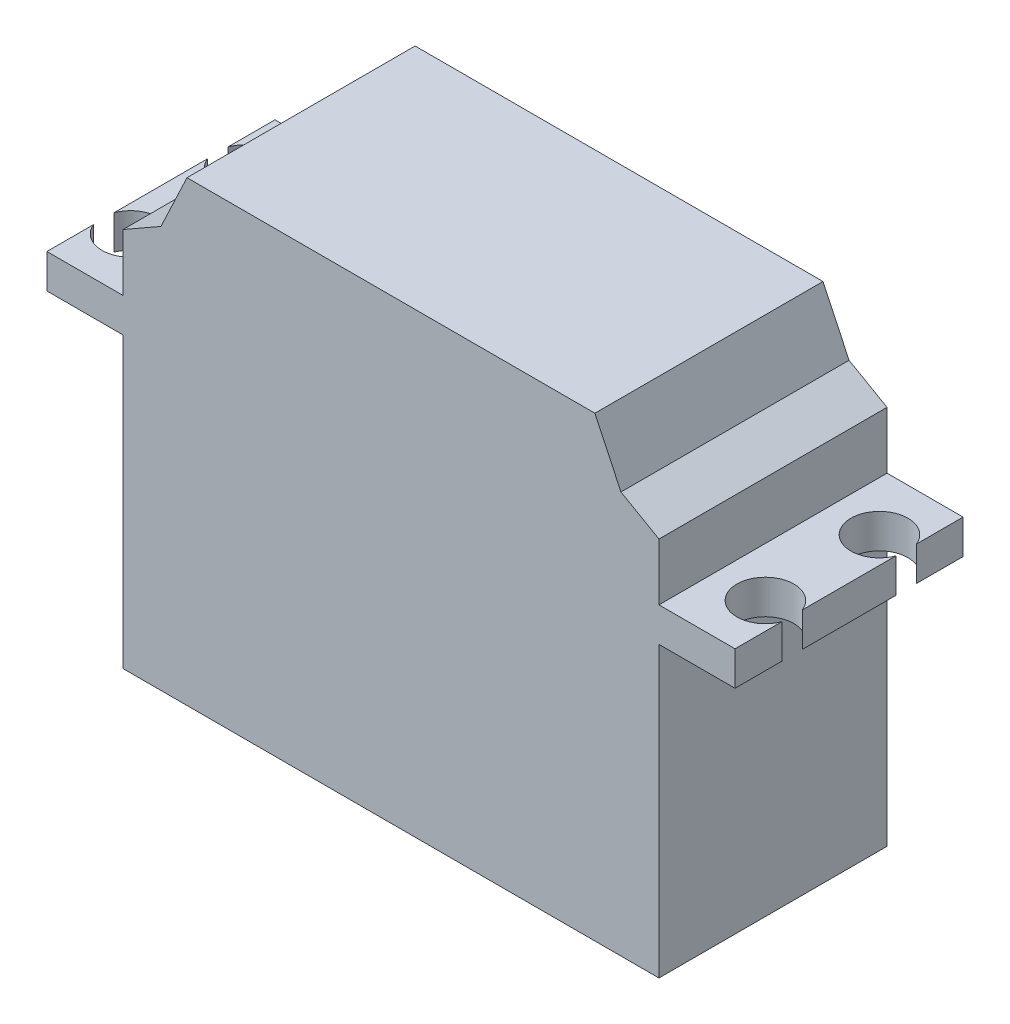
ISO-10303-21;
HEADER;
FILE_DESCRIPTION(('STEP AP214'),'2;1');
FILE_NAME('part.step','',(''),(''),'','','');
FILE_SCHEMA(('AUTOMOTIVE_DESIGN { 1 0 10303 214 1 1 1 1 }'));
ENDSEC;
DATA;
#1=APPLICATION_CONTEXT('core data for automotive mechanical design processes');
#2=APPLICATION_PROTOCOL_DEFINITION('international standard','automotive_design',2000,#1);
#3=PRODUCT_CONTEXT('',#1,'mechanical');
#4=PRODUCT('Part','Part','',(#3));
#5=PRODUCT_RELATED_PRODUCT_CATEGORY('part','',(#4));
#6=PRODUCT_DEFINITION_FORMATION('','',#4);
#7=PRODUCT_DEFINITION_CONTEXT('part definition',#1,'design');
#8=PRODUCT_DEFINITION('design','',#6,#7);
#9=PRODUCT_DEFINITION_SHAPE('','',#8);
#10=(LENGTH_UNIT() NAMED_UNIT(*) SI_UNIT(.MILLI.,.METRE.));
#11=(NAMED_UNIT(*) PLANE_ANGLE_UNIT() SI_UNIT($,.RADIAN.));
#12=(NAMED_UNIT(*) SI_UNIT($,.STERADIAN.) SOLID_ANGLE_UNIT());
#13=UNCERTAINTY_MEASURE_WITH_UNIT(LENGTH_MEASURE(1.E-05),#10,'distance_accuracy_value','');
#14=(GEOMETRIC_REPRESENTATION_CONTEXT(3) GLOBAL_UNCERTAINTY_ASSIGNED_CONTEXT((#13)) GLOBAL_UNIT_ASSIGNED_CONTEXT((#10,
#11,#12)) REPRESENTATION_CONTEXT('',''));
#15=CARTESIAN_POINT('',(0.,0.,0.));
#16=DIRECTION('',(0.,0.,1.));
#17=DIRECTION('',(1.,0.,0.));
#18=AXIS2_PLACEMENT_3D('',#15,#16,#17);
#19=CARTESIAN_POINT('',(-22.987,19.304,13.1906548986632));
#20=DIRECTION('',(-1.,0.,0.));
#21=DIRECTION('',(0.,0.,-1.));
#22=AXIS2_PLACEMENT_3D('',#19,#20,#21);
#23=PLANE('',#22);
#24=DIRECTION('',(0.,1.,0.));
#25=VECTOR('',#24,1.);
#26=CARTESIAN_POINT('',(-22.987,13.9158463273585,-4.49391593050608));
#27=LINE('',#26,#25);
#28=CARTESIAN_POINT('',(-22.987,19.304,-4.49391593050608));
#29=VERTEX_POINT('',#28);
#30=CARTESIAN_POINT('',(-22.987,21.59,-4.49391593050608));
#31=VERTEX_POINT('',#30);
#32=EDGE_CURVE('E11',#29,#31,#27,.T.);
#33=ORIENTED_EDGE('',*,*,#32,.T.);
#34=DIRECTION('',(0.,0.,-1.));
#35=VECTOR('',#34,1.);
#36=CARTESIAN_POINT('',(-22.987,21.59,13.1906548986632));
#37=LINE('',#36,#35);
#38=CARTESIAN_POINT('',(-22.987,21.59,-7.62));
#39=VERTEX_POINT('',#38);
#40=EDGE_CURVE('E267',#31,#39,#37,.T.);
#41=ORIENTED_EDGE('',*,*,#40,.T.);
#42=DIRECTION('',(0.,-1.,0.));
#43=VECTOR('',#42,1.);
#44=CARTESIAN_POINT('',(-22.987,19.304,-7.62));
#45=LINE('',#44,#43);
#46=CARTESIAN_POINT('',(-22.987,19.304,-7.62));
#47=VERTEX_POINT('',#46);
#48=EDGE_CURVE('E400',#39,#47,#45,.T.);
#49=ORIENTED_EDGE('',*,*,#48,.T.);
#50=DIRECTION('',(0.,0.,-1.));
#51=VECTOR('',#50,1.);
#52=CARTESIAN_POINT('',(-22.987,19.304,13.1906548986632));
#53=LINE('',#52,#51);
#54=EDGE_CURVE('E259',#29,#47,#53,.T.);
#55=ORIENTED_EDGE('',*,*,#54,.F.);
#56=EDGE_LOOP('',(#33,#41,#49,#55));
#57=FACE_BOUND('',#56,.T.);
#58=ADVANCED_FACE('F37',(#57),#23,.T.);
#59=DIRECTION('',(0.,1.,0.));
#60=VECTOR('',#59,1.);
#61=CARTESIAN_POINT('',(-22.987,13.9158463273585,-3.12608406949392));
#62=LINE('',#61,#60);
#63=CARTESIAN_POINT('',(-22.987,21.59,-3.12608406949392));
#64=VERTEX_POINT('',#63);
#65=CARTESIAN_POINT('',(-22.987,19.304,-3.12608406949392));
#66=VERTEX_POINT('',#65);
#67=EDGE_CURVE('E45',#64,#66,#62,.F.);
#68=ORIENTED_EDGE('',*,*,#67,.T.);
#69=CARTESIAN_POINT('',(-22.987,19.304,3.12608406949391));
#70=VERTEX_POINT('',#69);
#71=EDGE_CURVE('E245',#70,#66,#53,.T.);
#72=ORIENTED_EDGE('',*,*,#71,.F.);
#73=DIRECTION('',(0.,1.,0.));
#74=VECTOR('',#73,1.);
#75=CARTESIAN_POINT('',(-22.987,13.9158463273585,3.12608406949391));
#76=LINE('',#75,#74);
#77=CARTESIAN_POINT('',(-22.987,21.59,3.12608406949391));
#78=VERTEX_POINT('',#77);
#79=EDGE_CURVE('E237',#70,#78,#76,.T.);
#80=ORIENTED_EDGE('',*,*,#79,.T.);
#81=EDGE_CURVE('E246',#78,#64,#37,.T.);
#82=ORIENTED_EDGE('',*,*,#81,.T.);
#83=EDGE_LOOP('',(#68,#72,#80,#82));
#84=FACE_BOUND('',#83,.T.);
#85=ADVANCED_FACE('F243',(#84),#23,.T.);
#86=CARTESIAN_POINT('',(22.987,19.304,13.1906548986632));
#87=DIRECTION('',(1.,0.,0.));
#88=DIRECTION('',(0.,0.,1.));
#89=AXIS2_PLACEMENT_3D('',#86,#87,#88);
#90=PLANE('',#89);
#91=DIRECTION('',(0.,1.,0.));
#92=VECTOR('',#91,1.);
#93=CARTESIAN_POINT('',(22.987,13.9158463273585,4.4939159305061));
#94=LINE('',#93,#92);
#95=CARTESIAN_POINT('',(22.987,19.304,4.4939159305061));
#96=VERTEX_POINT('',#95);
#97=CARTESIAN_POINT('',(22.987,21.59,4.4939159305061));
#98=VERTEX_POINT('',#97);
#99=EDGE_CURVE('E228',#96,#98,#94,.T.);
#100=ORIENTED_EDGE('',*,*,#99,.T.);
#101=DIRECTION('',(0.,0.,-1.));
#102=VECTOR('',#101,1.);
#103=CARTESIAN_POINT('',(22.987,21.59,13.1906548986632));
#104=LINE('',#103,#102);
#105=CARTESIAN_POINT('',(22.987,21.59,7.62));
#106=VERTEX_POINT('',#105);
#107=EDGE_CURVE('E220',#106,#98,#104,.T.);
#108=ORIENTED_EDGE('',*,*,#107,.F.);
#109=DIRECTION('',(0.,-1.,0.));
#110=VECTOR('',#109,1.);
#111=CARTESIAN_POINT('',(22.987,19.304,7.62));
#112=LINE('',#111,#110);
#113=CARTESIAN_POINT('',(22.987,19.304,7.62));
#114=VERTEX_POINT('',#113);
#115=EDGE_CURVE('E389',#106,#114,#112,.T.);
#116=ORIENTED_EDGE('',*,*,#115,.T.);
#117=DIRECTION('',(0.,0.,-1.));
#118=VECTOR('',#117,1.);
#119=CARTESIAN_POINT('',(22.987,19.304,13.1906548986632));
#120=LINE('',#119,#118);
#121=EDGE_CURVE('E385',#114,#96,#120,.T.);
#122=ORIENTED_EDGE('',*,*,#121,.T.);
#123=EDGE_LOOP('',(#100,#108,#116,#122));
#124=FACE_BOUND('',#123,.T.);
#125=ADVANCED_FACE('F433',(#124),#90,.T.);
#126=DIRECTION('',(0.,1.,0.));
#127=VECTOR('',#126,1.);
#128=CARTESIAN_POINT('',(22.987,13.9158463273585,3.12608406949393));
#129=LINE('',#128,#127);
#130=CARTESIAN_POINT('',(22.987,21.59,3.12608406949393));
#131=VERTEX_POINT('',#130);
#132=CARTESIAN_POINT('',(22.987,19.304,3.12608406949393));
#133=VERTEX_POINT('',#132);
#134=EDGE_CURVE('E226',#131,#133,#129,.F.);
#135=ORIENTED_EDGE('',*,*,#134,.T.);
#136=CARTESIAN_POINT('',(22.987,19.304,-3.12608406949391));
#137=VERTEX_POINT('',#136);
#138=EDGE_CURVE('E225',#133,#137,#120,.T.);
#139=ORIENTED_EDGE('',*,*,#138,.T.);
#140=DIRECTION('',(0.,1.,0.));
#141=VECTOR('',#140,1.);
#142=CARTESIAN_POINT('',(22.987,13.9158463273585,-3.12608406949391));
#143=LINE('',#142,#141);
#144=CARTESIAN_POINT('',(22.987,21.59,-3.12608406949391));
#145=VERTEX_POINT('',#144);
#146=EDGE_CURVE('E204',#137,#145,#143,.T.);
#147=ORIENTED_EDGE('',*,*,#146,.T.);
#148=EDGE_CURVE('E213',#131,#145,#104,.T.);
#149=ORIENTED_EDGE('',*,*,#148,.F.);
#150=EDGE_LOOP('',(#135,#139,#147,#149));
#151=FACE_BOUND('',#150,.T.);
#152=ADVANCED_FACE('F223',(#151),#90,.T.);
#153=CARTESIAN_POINT('',(17.907,25.4,7.62));
#154=DIRECTION('',(-1.,0.,0.));
#155=DIRECTION('',(0.,0.,-1.));
#156=AXIS2_PLACEMENT_3D('',#153,#154,#155);
#157=PLANE('',#156);
#158=DIRECTION('',(0.,0.,-1.));
#159=VECTOR('',#158,1.);
#160=CARTESIAN_POINT('',(17.907,21.59,13.1906548986632));
#161=LINE('',#160,#159);
#162=CARTESIAN_POINT('',(17.907,21.59,7.62));
#163=VERTEX_POINT('',#162);
#164=CARTESIAN_POINT('',(17.907,21.59,-7.62));
#165=VERTEX_POINT('',#164);
#166=EDGE_CURVE('E377',#163,#165,#161,.T.);
#167=ORIENTED_EDGE('',*,*,#166,.T.);
#168=DIRECTION('',(0.,-1.,0.));
#169=VECTOR('',#168,1.);
#170=CARTESIAN_POINT('',(17.907,25.4,-7.62));
#171=LINE('',#170,#169);
#172=CARTESIAN_POINT('',(17.907,25.4,-7.62));
#173=VERTEX_POINT('',#172);
#174=EDGE_CURVE('E325',#173,#165,#171,.T.);
#175=ORIENTED_EDGE('',*,*,#174,.F.);
#176=DIRECTION('',(0.,0.,1.));
#177=VECTOR('',#176,1.);
#178=CARTESIAN_POINT('',(17.907,25.4,7.62));
#179=LINE('',#178,#177);
#180=CARTESIAN_POINT('',(17.907,25.4,7.62));
#181=VERTEX_POINT('',#180);
#182=EDGE_CURVE('E309',#173,#181,#179,.T.);
#183=ORIENTED_EDGE('',*,*,#182,.T.);
#184=DIRECTION('',(0.,-1.,0.));
#185=VECTOR('',#184,1.);
#186=CARTESIAN_POINT('',(17.907,25.4,7.62));
#187=LINE('',#186,#185);
#188=EDGE_CURVE('E230',#181,#163,#187,.T.);
#189=ORIENTED_EDGE('',*,*,#188,.T.);
#190=EDGE_LOOP('',(#167,#175,#183,#189));
#191=FACE_BOUND('',#190,.T.);
#192=ADVANCED_FACE('F460',(#191),#157,.F.);
#193=CARTESIAN_POINT('',(-17.907,25.4,7.62));
#194=DIRECTION('',(1.,0.,0.));
#195=DIRECTION('',(0.,0.,1.));
#196=AXIS2_PLACEMENT_3D('',#193,#194,#195);
#197=PLANE('',#196);
#198=DIRECTION('',(0.,0.,-1.));
#199=VECTOR('',#198,1.);
#200=CARTESIAN_POINT('',(-17.907,19.304,13.1906548986632));
#201=LINE('',#200,#199);
#202=CARTESIAN_POINT('',(-17.907,19.304,7.62));
#203=VERTEX_POINT('',#202);
#204=CARTESIAN_POINT('',(-17.907,19.304,-7.62));
#205=VERTEX_POINT('',#204);
#206=EDGE_CURVE('E261',#203,#205,#201,.T.);
#207=ORIENTED_EDGE('',*,*,#206,.T.);
#208=DIRECTION('',(0.,-1.,0.));
#209=VECTOR('',#208,1.);
#210=CARTESIAN_POINT('',(-17.907,25.4,-7.62));
#211=LINE('',#210,#209);
#212=CARTESIAN_POINT('',(-17.907,0.,-7.62));
#213=VERTEX_POINT('',#212);
#214=EDGE_CURVE('E328',#205,#213,#211,.T.);
#215=ORIENTED_EDGE('',*,*,#214,.T.);
#216=DIRECTION('',(0.,0.,-1.));
#217=VECTOR('',#216,1.);
#218=CARTESIAN_POINT('',(-17.907,0.,7.62));
#219=LINE('',#218,#217);
#220=CARTESIAN_POINT('',(-17.907,0.,7.62));
#221=VERTEX_POINT('',#220);
#222=EDGE_CURVE('E321',#221,#213,#219,.T.);
#223=ORIENTED_EDGE('',*,*,#222,.F.);
#224=DIRECTION('',(0.,-1.,0.));
#225=VECTOR('',#224,1.);
#226=CARTESIAN_POINT('',(-17.907,25.4,7.62));
#227=LINE('',#226,#225);
#228=EDGE_CURVE('E332',#203,#221,#227,.T.);
#229=ORIENTED_EDGE('',*,*,#228,.F.);
#230=EDGE_LOOP('',(#207,#215,#223,#229));
#231=FACE_BOUND('',#230,.T.);
#232=ADVANCED_FACE('F408',(#231),#197,.F.);
#233=CARTESIAN_POINT('',(17.907,19.304,7.62));
#234=VERTEX_POINT('',#233);
#235=CARTESIAN_POINT('',(17.907,0.,7.62));
#236=VERTEX_POINT('',#235);
#237=EDGE_CURVE('E335',#234,#236,#187,.T.);
#238=ORIENTED_EDGE('',*,*,#237,.T.);
#239=DIRECTION('',(0.,0.,1.));
#240=VECTOR('',#239,1.);
#241=CARTESIAN_POINT('',(17.907,0.,7.62));
#242=LINE('',#241,#240);
#243=CARTESIAN_POINT('',(17.907,0.,-7.62));
#244=VERTEX_POINT('',#243);
#245=EDGE_CURVE('E308',#244,#236,#242,.T.);
#246=ORIENTED_EDGE('',*,*,#245,.F.);
#247=CARTESIAN_POINT('',(17.907,19.304,-7.62));
#248=VERTEX_POINT('',#247);
#249=EDGE_CURVE('E316',#248,#244,#171,.T.);
#250=ORIENTED_EDGE('',*,*,#249,.F.);
#251=DIRECTION('',(0.,0.,-1.));
#252=VECTOR('',#251,1.);
#253=CARTESIAN_POINT('',(17.907,19.304,13.1906548986632));
#254=LINE('',#253,#252);
#255=EDGE_CURVE('E348',#234,#248,#254,.T.);
#256=ORIENTED_EDGE('',*,*,#255,.F.);
#257=EDGE_LOOP('',(#238,#246,#250,#256));
#258=FACE_BOUND('',#257,.T.);
#259=ADVANCED_FACE('F39',(#258),#157,.F.);
#260=CARTESIAN_POINT('',(-17.907,25.4,7.62));
#261=DIRECTION('',(0.,0.,-1.));
#262=DIRECTION('',(1.,0.,0.));
#263=AXIS2_PLACEMENT_3D('',#260,#261,#262);
#264=PLANE('',#263);
#265=DIRECTION('',(0.868243142124459,0.496138938356834,0.));
#266=VECTOR('',#265,1.);
#267=CARTESIAN_POINT('',(-17.907,25.4,7.62));
#268=LINE('',#267,#266);
#269=CARTESIAN_POINT('',(-17.907,25.4,7.62));
#270=VERTEX_POINT('',#269);
#271=CARTESIAN_POINT('',(-15.367,26.8514285714286,7.62));
#272=VERTEX_POINT('',#271);
#273=EDGE_CURVE('E299',#270,#272,#268,.T.);
#274=ORIENTED_EDGE('',*,*,#273,.F.);
#275=CARTESIAN_POINT('',(-17.907,21.59,7.62));
#276=VERTEX_POINT('',#275);
#277=EDGE_CURVE('E333',#270,#276,#227,.T.);
#278=ORIENTED_EDGE('',*,*,#277,.T.);
#279=DIRECTION('',(1.,0.,0.));
#280=VECTOR('',#279,1.);
#281=CARTESIAN_POINT('',(-22.987,21.59,7.62));
#282=LINE('',#281,#280);
#283=CARTESIAN_POINT('',(-22.987,21.59,7.62));
#284=VERTEX_POINT('',#283);
#285=EDGE_CURVE('E272',#284,#276,#282,.T.);
#286=ORIENTED_EDGE('',*,*,#285,.F.);
#287=DIRECTION('',(0.,1.,0.));
#288=VECTOR('',#287,1.);
#289=CARTESIAN_POINT('',(-22.987,19.304,7.62));
#290=LINE('',#289,#288);
#291=CARTESIAN_POINT('',(-22.987,19.304,7.62));
#292=VERTEX_POINT('',#291);
#293=EDGE_CURVE('E268',#292,#284,#290,.T.);
#294=ORIENTED_EDGE('',*,*,#293,.F.);
#295=DIRECTION('',(-1.,0.,0.));
#296=VECTOR('',#295,1.);
#297=CARTESIAN_POINT('',(-17.907,19.304,7.62));
#298=LINE('',#297,#296);
#299=EDGE_CURVE('E393',#203,#292,#298,.T.);
#300=ORIENTED_EDGE('',*,*,#299,.F.);
#301=ORIENTED_EDGE('',*,*,#228,.T.);
#302=DIRECTION('',(-1.,0.,0.));
#303=VECTOR('',#302,1.);
#304=CARTESIAN_POINT('',(-17.907,0.,7.62));
#305=LINE('',#304,#303);
#306=EDGE_CURVE('E319',#236,#221,#305,.T.);
#307=ORIENTED_EDGE('',*,*,#306,.F.);
#308=ORIENTED_EDGE('',*,*,#237,.F.);
#309=DIRECTION('',(-1.,0.,0.));
#310=VECTOR('',#309,1.);
#311=CARTESIAN_POINT('',(17.907,19.304,7.62));
#312=LINE('',#311,#310);
#313=EDGE_CURVE('E353',#114,#234,#312,.T.);
#314=ORIENTED_EDGE('',*,*,#313,.F.);
#315=ORIENTED_EDGE('',*,*,#115,.F.);
#316=DIRECTION('',(1.,0.,0.));
#317=VECTOR('',#316,1.);
#318=CARTESIAN_POINT('',(22.987,21.59,7.62));
#319=LINE('',#318,#317);
#320=EDGE_CURVE('E376',#163,#106,#319,.T.);
#321=ORIENTED_EDGE('',*,*,#320,.F.);
#322=ORIENTED_EDGE('',*,*,#188,.F.);
#323=DIRECTION('',(0.868243142124459,-0.496138938356834,0.));
#324=VECTOR('',#323,1.);
#325=CARTESIAN_POINT('',(9.017,30.48,7.62));
#326=LINE('',#325,#324);
#327=CARTESIAN_POINT('',(15.367,26.8514285714286,7.62));
#328=VERTEX_POINT('',#327);
#329=EDGE_CURVE('E302',#328,#181,#326,.T.);
#330=ORIENTED_EDGE('',*,*,#329,.F.);
#331=DIRECTION('',(0.426649540613449,-0.90441703295235,0.));
#332=VECTOR('',#331,1.);
#333=CARTESIAN_POINT('',(15.367,26.8514285714286,7.62));
#334=LINE('',#333,#332);
#335=CARTESIAN_POINT('',(13.6268844552524,30.5401472694776,7.62));
#336=VERTEX_POINT('',#335);
#337=EDGE_CURVE('E273',#336,#328,#334,.T.);
#338=ORIENTED_EDGE('',*,*,#337,.F.);
#339=DIRECTION('',(1.,0.,0.));
#340=VECTOR('',#339,1.);
#341=CARTESIAN_POINT('',(-13.6268844552524,30.5401472694776,7.62));
#342=LINE('',#341,#340);
#343=CARTESIAN_POINT('',(-13.6268844552524,30.5401472694776,7.62));
#344=VERTEX_POINT('',#343);
#345=EDGE_CURVE('E276',#344,#336,#342,.T.);
#346=ORIENTED_EDGE('',*,*,#345,.F.);
#347=DIRECTION('',(0.426649540613449,0.90441703295235,0.));
#348=VECTOR('',#347,1.);
#349=CARTESIAN_POINT('',(-15.367,26.8514285714286,7.62));
#350=LINE('',#349,#348);
#351=EDGE_CURVE('E280',#272,#344,#350,.T.);
#352=ORIENTED_EDGE('',*,*,#351,.F.);
#353=EDGE_LOOP('',(#274,#278,#286,#294,#300,#301,#307,#308,#314,#315,#321,#322,#330,#338,#346,#352));
#354=FACE_BOUND('',#353,.T.);
#355=ADVANCED_FACE('F351',(#354),#264,.F.);
#356=ORIENTED_EDGE('',*,*,#277,.F.);
#357=DIRECTION('',(0.,0.,-1.));
#358=VECTOR('',#357,1.);
#359=CARTESIAN_POINT('',(-17.907,25.4,7.62));
#360=LINE('',#359,#358);
#361=CARTESIAN_POINT('',(-17.907,25.4,-7.62));
#362=VERTEX_POINT('',#361);
#363=EDGE_CURVE('E312',#270,#362,#360,.T.);
#364=ORIENTED_EDGE('',*,*,#363,.T.);
#365=CARTESIAN_POINT('',(-17.907,21.59,-7.62));
#366=VERTEX_POINT('',#365);
#367=EDGE_CURVE('E329',#362,#366,#211,.T.);
#368=ORIENTED_EDGE('',*,*,#367,.T.);
#369=DIRECTION('',(0.,0.,-1.));
#370=VECTOR('',#369,1.);
#371=CARTESIAN_POINT('',(-17.907,21.59,13.1906548986632));
#372=LINE('',#371,#370);
#373=EDGE_CURVE('E396',#276,#366,#372,.T.);
#374=ORIENTED_EDGE('',*,*,#373,.F.);
#375=EDGE_LOOP('',(#356,#364,#368,#374));
#376=FACE_BOUND('',#375,.T.);
#377=ADVANCED_FACE('F477',(#376),#197,.F.);
#378=CARTESIAN_POINT('',(-17.907,25.4,-7.62));
#379=DIRECTION('',(0.,0.,1.));
#380=DIRECTION('',(-1.,0.,0.));
#381=AXIS2_PLACEMENT_3D('',#378,#379,#380);
#382=PLANE('',#381);
#383=DIRECTION('',(-0.426649540613449,-0.90441703295235,0.));
#384=VECTOR('',#383,1.);
#385=CARTESIAN_POINT('',(-15.367,26.8514285714286,-7.62));
#386=LINE('',#385,#384);
#387=CARTESIAN_POINT('',(-13.6268844552524,30.5401472694776,-7.62));
#388=VERTEX_POINT('',#387);
#389=CARTESIAN_POINT('',(-15.367,26.8514285714286,-7.62));
#390=VERTEX_POINT('',#389);
#391=EDGE_CURVE('E289',#388,#390,#386,.T.);
#392=ORIENTED_EDGE('',*,*,#391,.F.);
#393=DIRECTION('',(-1.,0.,0.));
#394=VECTOR('',#393,1.);
#395=CARTESIAN_POINT('',(-13.6268844552524,30.5401472694776,-7.62));
#396=LINE('',#395,#394);
#397=CARTESIAN_POINT('',(13.6268844552524,30.5401472694776,-7.62));
#398=VERTEX_POINT('',#397);
#399=EDGE_CURVE('E286',#398,#388,#396,.T.);
#400=ORIENTED_EDGE('',*,*,#399,.F.);
#401=DIRECTION('',(-0.426649540613449,0.90441703295235,0.));
#402=VECTOR('',#401,1.);
#403=CARTESIAN_POINT('',(15.367,26.8514285714286,-7.62));
#404=LINE('',#403,#402);
#405=CARTESIAN_POINT('',(15.367,26.8514285714286,-7.62));
#406=VERTEX_POINT('',#405);
#407=EDGE_CURVE('E271',#406,#398,#404,.T.);
#408=ORIENTED_EDGE('',*,*,#407,.F.);
#409=DIRECTION('',(-0.868243142124459,0.496138938356834,0.));
#410=VECTOR('',#409,1.);
#411=CARTESIAN_POINT('',(9.017,30.48,-7.62));
#412=LINE('',#411,#410);
#413=EDGE_CURVE('E283',#173,#406,#412,.T.);
#414=ORIENTED_EDGE('',*,*,#413,.F.);
#415=ORIENTED_EDGE('',*,*,#174,.T.);
#416=DIRECTION('',(-1.,0.,0.));
#417=VECTOR('',#416,1.);
#418=CARTESIAN_POINT('',(22.987,21.59,-7.62));
#419=LINE('',#418,#417);
#420=CARTESIAN_POINT('',(22.987,21.59,-7.62));
#421=VERTEX_POINT('',#420);
#422=EDGE_CURVE('E382',#421,#165,#419,.T.);
#423=ORIENTED_EDGE('',*,*,#422,.F.);
#424=DIRECTION('',(0.,1.,0.));
#425=VECTOR('',#424,1.);
#426=CARTESIAN_POINT('',(22.987,19.304,-7.62));
#427=LINE('',#426,#425);
#428=CARTESIAN_POINT('',(22.987,19.304,-7.62));
#429=VERTEX_POINT('',#428);
#430=EDGE_CURVE('E371',#429,#421,#427,.T.);
#431=ORIENTED_EDGE('',*,*,#430,.F.);
#432=DIRECTION('',(1.,0.,0.));
#433=VECTOR('',#432,1.);
#434=CARTESIAN_POINT('',(17.907,19.304,-7.62));
#435=LINE('',#434,#433);
#436=EDGE_CURVE('E368',#248,#429,#435,.T.);
#437=ORIENTED_EDGE('',*,*,#436,.F.);
#438=ORIENTED_EDGE('',*,*,#249,.T.);
#439=DIRECTION('',(1.,0.,0.));
#440=VECTOR('',#439,1.);
#441=CARTESIAN_POINT('',(-17.907,0.,-7.62));
#442=LINE('',#441,#440);
#443=EDGE_CURVE('E313',#213,#244,#442,.T.);
#444=ORIENTED_EDGE('',*,*,#443,.F.);
#445=ORIENTED_EDGE('',*,*,#214,.F.);
#446=DIRECTION('',(1.,0.,0.));
#447=VECTOR('',#446,1.);
#448=CARTESIAN_POINT('',(-17.907,19.304,-7.62));
#449=LINE('',#448,#447);
#450=EDGE_CURVE('E403',#47,#205,#449,.T.);
#451=ORIENTED_EDGE('',*,*,#450,.F.);
#452=ORIENTED_EDGE('',*,*,#48,.F.);
#453=DIRECTION('',(-1.,0.,0.));
#454=VECTOR('',#453,1.);
#455=CARTESIAN_POINT('',(-22.987,21.59,-7.62));
#456=LINE('',#455,#454);
#457=EDGE_CURVE('E392',#366,#39,#456,.T.);
#458=ORIENTED_EDGE('',*,*,#457,.F.);
#459=ORIENTED_EDGE('',*,*,#367,.F.);
#460=DIRECTION('',(-0.868243142124459,-0.496138938356834,0.));
#461=VECTOR('',#460,1.);
#462=CARTESIAN_POINT('',(-17.907,25.4,-7.62));
#463=LINE('',#462,#461);
#464=EDGE_CURVE('E303',#390,#362,#463,.T.);
#465=ORIENTED_EDGE('',*,*,#464,.F.);
#466=EDGE_LOOP('',(#392,#400,#408,#414,#415,#423,#431,#437,#438,#444,#445,#451,#452,#458,#459,#465));
#467=FACE_BOUND('',#466,.T.);
#468=ADVANCED_FACE('F365',(#467),#382,.F.);
#469=CARTESIAN_POINT('',(0.,0.,0.));
#470=DIRECTION('',(0.,1.,0.));
#471=DIRECTION('',(0.,0.,-1.));
#472=AXIS2_PLACEMENT_3D('',#469,#470,#471);
#473=PLANE('',#472);
#474=ORIENTED_EDGE('',*,*,#245,.T.);
#475=ORIENTED_EDGE('',*,*,#306,.T.);
#476=ORIENTED_EDGE('',*,*,#222,.T.);
#477=ORIENTED_EDGE('',*,*,#443,.T.);
#478=EDGE_LOOP('',(#474,#475,#476,#477));
#479=FACE_BOUND('',#478,.T.);
#480=ADVANCED_FACE('F359',(#479),#473,.F.);
#481=CARTESIAN_POINT('',(-17.907,25.4,43.7924894913248));
#482=DIRECTION('',(-0.496138938356834,0.868243142124459,0.));
#483=DIRECTION('',(-0.868243142124459,-0.496138938356834,0.));
#484=AXIS2_PLACEMENT_3D('',#481,#482,#483);
#485=PLANE('',#484);
#486=DIRECTION('',(0.,0.,-1.));
#487=VECTOR('',#486,1.);
#488=CARTESIAN_POINT('',(-15.367,26.8514285714286,38.5745699636312));
#489=LINE('',#488,#487);
#490=EDGE_CURVE('E277',#272,#390,#489,.T.);
#491=ORIENTED_EDGE('',*,*,#490,.T.);
#492=ORIENTED_EDGE('',*,*,#464,.T.);
#493=ORIENTED_EDGE('',*,*,#363,.F.);
#494=ORIENTED_EDGE('',*,*,#273,.T.);
#495=EDGE_LOOP('',(#491,#492,#493,#494));
#496=FACE_BOUND('',#495,.T.);
#497=ADVANCED_FACE('F473',(#496),#485,.T.);
#498=CARTESIAN_POINT('',(9.017,30.48,43.7924894913248));
#499=DIRECTION('',(0.496138938356834,0.868243142124459,0.));
#500=DIRECTION('',(-0.868243142124459,0.496138938356834,0.));
#501=AXIS2_PLACEMENT_3D('',#498,#499,#500);
#502=PLANE('',#501);
#503=DIRECTION('',(0.,0.,-1.));
#504=VECTOR('',#503,1.);
#505=CARTESIAN_POINT('',(15.367,26.8514285714286,38.5745699636312));
#506=LINE('',#505,#504);
#507=EDGE_CURVE('E292',#328,#406,#506,.T.);
#508=ORIENTED_EDGE('',*,*,#507,.F.);
#509=ORIENTED_EDGE('',*,*,#329,.T.);
#510=ORIENTED_EDGE('',*,*,#182,.F.);
#511=ORIENTED_EDGE('',*,*,#413,.T.);
#512=EDGE_LOOP('',(#508,#509,#510,#511));
#513=FACE_BOUND('',#512,.T.);
#514=ADVANCED_FACE('F465',(#513),#502,.T.);
#515=CARTESIAN_POINT('',(-15.367,26.8514285714286,38.5745699636312));
#516=DIRECTION('',(-0.90441703295235,0.426649540613449,0.));
#517=DIRECTION('',(-0.426649540613449,-0.90441703295235,0.));
#518=AXIS2_PLACEMENT_3D('',#515,#516,#517);
#519=PLANE('',#518);
#520=ORIENTED_EDGE('',*,*,#351,.T.);
#521=DIRECTION('',(0.,0.,-1.));
#522=VECTOR('',#521,1.);
#523=CARTESIAN_POINT('',(-13.6268844552524,30.5401472694776,38.5745699636312));
#524=LINE('',#523,#522);
#525=EDGE_CURVE('E294',#344,#388,#524,.T.);
#526=ORIENTED_EDGE('',*,*,#525,.T.);
#527=ORIENTED_EDGE('',*,*,#391,.T.);
#528=ORIENTED_EDGE('',*,*,#490,.F.);
#529=EDGE_LOOP('',(#520,#526,#527,#528));
#530=FACE_BOUND('',#529,.T.);
#531=ADVANCED_FACE('F471',(#530),#519,.T.);
#532=CARTESIAN_POINT('',(-13.6268844552524,30.5401472694776,38.5745699636312));
#533=DIRECTION('',(0.,1.,0.));
#534=DIRECTION('',(0.,0.,-1.));
#535=AXIS2_PLACEMENT_3D('',#532,#533,#534);
#536=PLANE('',#535);
#537=ORIENTED_EDGE('',*,*,#345,.T.);
#538=DIRECTION('',(0.,0.,-1.));
#539=VECTOR('',#538,1.);
#540=CARTESIAN_POINT('',(13.6268844552524,30.5401472694776,38.5745699636312));
#541=LINE('',#540,#539);
#542=EDGE_CURVE('E296',#336,#398,#541,.T.);
#543=ORIENTED_EDGE('',*,*,#542,.T.);
#544=ORIENTED_EDGE('',*,*,#399,.T.);
#545=ORIENTED_EDGE('',*,*,#525,.F.);
#546=EDGE_LOOP('',(#537,#543,#544,#545));
#547=FACE_BOUND('',#546,.T.);
#548=ADVANCED_FACE('F424',(#547),#536,.T.);
#549=CARTESIAN_POINT('',(15.367,26.8514285714286,38.5745699636312));
#550=DIRECTION('',(0.90441703295235,0.426649540613449,0.));
#551=DIRECTION('',(-0.426649540613449,0.90441703295235,0.));
#552=AXIS2_PLACEMENT_3D('',#549,#550,#551);
#553=PLANE('',#552);
#554=ORIENTED_EDGE('',*,*,#337,.T.);
#555=ORIENTED_EDGE('',*,*,#507,.T.);
#556=ORIENTED_EDGE('',*,*,#407,.T.);
#557=ORIENTED_EDGE('',*,*,#542,.F.);
#558=EDGE_LOOP('',(#554,#555,#556,#557));
#559=FACE_BOUND('',#558,.T.);
#560=ADVANCED_FACE('F416',(#559),#553,.T.);
#561=CARTESIAN_POINT('',(-22.987,21.59,13.1906548986632));
#562=DIRECTION('',(0.,1.,0.));
#563=DIRECTION('',(0.,0.,-1.));
#564=AXIS2_PLACEMENT_3D('',#561,#562,#563);
#565=PLANE('',#564);
#566=CARTESIAN_POINT('',(-21.209,21.59,-3.81));
#567=DIRECTION('',(0.,-1.,0.));
#568=DIRECTION('',(0.,0.,1.));
#569=AXIS2_PLACEMENT_3D('',#566,#567,#568);
#570=CIRCLE('',#569,1.905);
#571=EDGE_CURVE('E52',#31,#64,#570,.T.);
#572=ORIENTED_EDGE('',*,*,#571,.T.);
#573=ORIENTED_EDGE('',*,*,#81,.F.);
#574=CARTESIAN_POINT('',(-21.209,21.59,3.81));
#575=DIRECTION('',(0.,-1.,0.));
#576=DIRECTION('',(0.,0.,-1.));
#577=AXIS2_PLACEMENT_3D('',#574,#575,#576);
#578=CIRCLE('',#577,1.905);
#579=CARTESIAN_POINT('',(-22.987,21.59,4.49391593050609));
#580=VERTEX_POINT('',#579);
#581=EDGE_CURVE('E442',#78,#580,#578,.T.);
#582=ORIENTED_EDGE('',*,*,#581,.T.);
#583=EDGE_CURVE('E262',#284,#580,#37,.T.);
#584=ORIENTED_EDGE('',*,*,#583,.F.);
#585=ORIENTED_EDGE('',*,*,#285,.T.);
#586=ORIENTED_EDGE('',*,*,#373,.T.);
#587=ORIENTED_EDGE('',*,*,#457,.T.);
#588=ORIENTED_EDGE('',*,*,#40,.F.);
#589=EDGE_LOOP('',(#572,#573,#582,#584,#585,#586,#587,#588));
#590=FACE_BOUND('',#589,.T.);
#591=ADVANCED_FACE('F414',(#590),#565,.T.);
#592=CARTESIAN_POINT('',(-17.907,19.304,13.1906548986632));
#593=DIRECTION('',(0.,-1.,0.));
#594=DIRECTION('',(0.,0.,1.));
#595=AXIS2_PLACEMENT_3D('',#592,#593,#594);
#596=PLANE('',#595);
#597=CARTESIAN_POINT('',(-21.209,19.304,-3.81));
#598=DIRECTION('',(0.,1.,0.));
#599=DIRECTION('',(0.,0.,1.));
#600=AXIS2_PLACEMENT_3D('',#597,#598,#599);
#601=CIRCLE('',#600,1.905);
#602=EDGE_CURVE('E210',#29,#66,#601,.F.);
#603=ORIENTED_EDGE('',*,*,#602,.F.);
#604=ORIENTED_EDGE('',*,*,#54,.T.);
#605=ORIENTED_EDGE('',*,*,#450,.T.);
#606=ORIENTED_EDGE('',*,*,#206,.F.);
#607=ORIENTED_EDGE('',*,*,#299,.T.);
#608=CARTESIAN_POINT('',(-22.987,19.304,4.49391593050609));
#609=VERTEX_POINT('',#608);
#610=EDGE_CURVE('E258',#292,#609,#53,.T.);
#611=ORIENTED_EDGE('',*,*,#610,.T.);
#612=CARTESIAN_POINT('',(-21.209,19.304,3.81));
#613=DIRECTION('',(0.,1.,0.));
#614=DIRECTION('',(0.,0.,1.));
#615=AXIS2_PLACEMENT_3D('',#612,#613,#614);
#616=CIRCLE('',#615,1.905);
#617=EDGE_CURVE('E256',#70,#609,#616,.F.);
#618=ORIENTED_EDGE('',*,*,#617,.F.);
#619=ORIENTED_EDGE('',*,*,#71,.T.);
#620=EDGE_LOOP('',(#603,#604,#605,#606,#607,#611,#618,#619));
#621=FACE_BOUND('',#620,.T.);
#622=ADVANCED_FACE('F254',(#621),#596,.T.);
#623=DIRECTION('',(0.,1.,0.));
#624=VECTOR('',#623,1.);
#625=CARTESIAN_POINT('',(-22.987,13.9158463273585,4.49391593050609));
#626=LINE('',#625,#624);
#627=EDGE_CURVE('E60',#580,#609,#626,.F.);
#628=ORIENTED_EDGE('',*,*,#627,.T.);
#629=ORIENTED_EDGE('',*,*,#610,.F.);
#630=ORIENTED_EDGE('',*,*,#293,.T.);
#631=ORIENTED_EDGE('',*,*,#583,.T.);
#632=EDGE_LOOP('',(#628,#629,#630,#631));
#633=FACE_BOUND('',#632,.T.);
#634=ADVANCED_FACE('F422',(#633),#23,.T.);
#635=CARTESIAN_POINT('',(17.907,19.304,13.1906548986632));
#636=DIRECTION('',(0.,-1.,0.));
#637=DIRECTION('',(1.,0.,0.));
#638=AXIS2_PLACEMENT_3D('',#635,#636,#637);
#639=PLANE('',#638);
#640=CARTESIAN_POINT('',(21.209,19.304,3.81000000000001));
#641=DIRECTION('',(0.,1.,0.));
#642=DIRECTION('',(0.,0.,1.));
#643=AXIS2_PLACEMENT_3D('',#640,#641,#642);
#644=CIRCLE('',#643,1.905);
#645=EDGE_CURVE('E451',#96,#133,#644,.F.);
#646=ORIENTED_EDGE('',*,*,#645,.F.);
#647=ORIENTED_EDGE('',*,*,#121,.F.);
#648=ORIENTED_EDGE('',*,*,#313,.T.);
#649=ORIENTED_EDGE('',*,*,#255,.T.);
#650=ORIENTED_EDGE('',*,*,#436,.T.);
#651=CARTESIAN_POINT('',(22.987,19.304,-4.49391593050606));
#652=VERTEX_POINT('',#651);
#653=EDGE_CURVE('E388',#652,#429,#120,.T.);
#654=ORIENTED_EDGE('',*,*,#653,.F.);
#655=CARTESIAN_POINT('',(21.209,19.304,-3.80999999999999));
#656=DIRECTION('',(0.,1.,0.));
#657=DIRECTION('',(0.,0.,1.));
#658=AXIS2_PLACEMENT_3D('',#655,#656,#657);
#659=CIRCLE('',#658,1.905);
#660=EDGE_CURVE('E209',#137,#652,#659,.F.);
#661=ORIENTED_EDGE('',*,*,#660,.F.);
#662=ORIENTED_EDGE('',*,*,#138,.F.);
#663=EDGE_LOOP('',(#646,#647,#648,#649,#650,#654,#661,#662));
#664=FACE_BOUND('',#663,.T.);
#665=ADVANCED_FACE('F375',(#664),#639,.T.);
#666=CARTESIAN_POINT('',(22.987,21.59,13.1906548986632));
#667=DIRECTION('',(0.,1.,0.));
#668=DIRECTION('',(-1.,0.,0.));
#669=AXIS2_PLACEMENT_3D('',#666,#667,#668);
#670=PLANE('',#669);
#671=CARTESIAN_POINT('',(21.209,21.59,3.81000000000001));
#672=DIRECTION('',(0.,-1.,0.));
#673=DIRECTION('',(0.,0.,1.));
#674=AXIS2_PLACEMENT_3D('',#671,#672,#673);
#675=CIRCLE('',#674,1.905);
#676=EDGE_CURVE('E216',#98,#131,#675,.T.);
#677=ORIENTED_EDGE('',*,*,#676,.T.);
#678=ORIENTED_EDGE('',*,*,#148,.T.);
#679=CARTESIAN_POINT('',(21.209,21.59,-3.80999999999999));
#680=DIRECTION('',(0.,-1.,0.));
#681=DIRECTION('',(0.,0.,-1.));
#682=AXIS2_PLACEMENT_3D('',#679,#680,#681);
#683=CIRCLE('',#682,1.905);
#684=CARTESIAN_POINT('',(22.987,21.59,-4.49391593050606));
#685=VERTEX_POINT('',#684);
#686=EDGE_CURVE('E199',#145,#685,#683,.T.);
#687=ORIENTED_EDGE('',*,*,#686,.T.);
#688=EDGE_CURVE('E221',#685,#421,#104,.T.);
#689=ORIENTED_EDGE('',*,*,#688,.T.);
#690=ORIENTED_EDGE('',*,*,#422,.T.);
#691=ORIENTED_EDGE('',*,*,#166,.F.);
#692=ORIENTED_EDGE('',*,*,#320,.T.);
#693=ORIENTED_EDGE('',*,*,#107,.T.);
#694=EDGE_LOOP('',(#677,#678,#687,#689,#690,#691,#692,#693));
#695=FACE_BOUND('',#694,.T.);
#696=ADVANCED_FACE('F214',(#695),#670,.T.);
#697=DIRECTION('',(0.,1.,0.));
#698=VECTOR('',#697,1.);
#699=CARTESIAN_POINT('',(22.987,13.9158463273585,-4.49391593050606));
#700=LINE('',#699,#698);
#701=EDGE_CURVE('E206',#685,#652,#700,.F.);
#702=ORIENTED_EDGE('',*,*,#701,.T.);
#703=ORIENTED_EDGE('',*,*,#653,.T.);
#704=ORIENTED_EDGE('',*,*,#430,.T.);
#705=ORIENTED_EDGE('',*,*,#688,.F.);
#706=EDGE_LOOP('',(#702,#703,#704,#705));
#707=FACE_BOUND('',#706,.T.);
#708=ADVANCED_FACE('F448',(#707),#90,.T.);
#709=CARTESIAN_POINT('',(21.209,13.9158463273585,-3.80999999999999));
#710=DIRECTION('',(0.,1.,0.));
#711=DIRECTION('',(0.,0.,-1.));
#712=AXIS2_PLACEMENT_3D('',#709,#710,#711);
#713=CYLINDRICAL_SURFACE('',#712,1.905);
#714=ORIENTED_EDGE('',*,*,#146,.F.);
#715=ORIENTED_EDGE('',*,*,#660,.T.);
#716=ORIENTED_EDGE('',*,*,#701,.F.);
#717=ORIENTED_EDGE('',*,*,#686,.F.);
#718=EDGE_LOOP('',(#714,#715,#716,#717));
#719=FACE_BOUND('',#718,.T.);
#720=ADVANCED_FACE('F201',(#719),#713,.F.);
#721=CARTESIAN_POINT('',(21.209,13.9158463273585,3.81000000000001));
#722=DIRECTION('',(0.,1.,0.));
#723=DIRECTION('',(0.,0.,-1.));
#724=AXIS2_PLACEMENT_3D('',#721,#722,#723);
#725=CYLINDRICAL_SURFACE('',#724,1.905);
#726=ORIENTED_EDGE('',*,*,#99,.F.);
#727=ORIENTED_EDGE('',*,*,#645,.T.);
#728=ORIENTED_EDGE('',*,*,#134,.F.);
#729=ORIENTED_EDGE('',*,*,#676,.F.);
#730=EDGE_LOOP('',(#726,#727,#728,#729));
#731=FACE_BOUND('',#730,.T.);
#732=ADVANCED_FACE('F455',(#731),#725,.F.);
#733=CARTESIAN_POINT('',(-21.209,13.9158463273585,3.81));
#734=DIRECTION('',(0.,1.,0.));
#735=DIRECTION('',(0.,0.,-1.));
#736=AXIS2_PLACEMENT_3D('',#733,#734,#735);
#737=CYLINDRICAL_SURFACE('',#736,1.905);
#738=ORIENTED_EDGE('',*,*,#79,.F.);
#739=ORIENTED_EDGE('',*,*,#617,.T.);
#740=ORIENTED_EDGE('',*,*,#627,.F.);
#741=ORIENTED_EDGE('',*,*,#581,.F.);
#742=EDGE_LOOP('',(#738,#739,#740,#741));
#743=FACE_BOUND('',#742,.T.);
#744=ADVANCED_FACE('F441',(#743),#737,.F.);
#745=CARTESIAN_POINT('',(-21.209,13.9158463273585,-3.81));
#746=DIRECTION('',(0.,1.,0.));
#747=DIRECTION('',(0.,0.,-1.));
#748=AXIS2_PLACEMENT_3D('',#745,#746,#747);
#749=CYLINDRICAL_SURFACE('',#748,1.905);
#750=ORIENTED_EDGE('',*,*,#32,.F.);
#751=ORIENTED_EDGE('',*,*,#602,.T.);
#752=ORIENTED_EDGE('',*,*,#67,.F.);
#753=ORIENTED_EDGE('',*,*,#571,.F.);
#754=EDGE_LOOP('',(#750,#751,#752,#753));
#755=FACE_BOUND('',#754,.T.);
#756=ADVANCED_FACE('F249',(#755),#749,.F.);
#757=CLOSED_SHELL('',(#58,#85,#125,#152,#192,#232,#259,#355,#377,#468,#480,#497,#514,#531,#548,
#560,#591,#622,#634,#665,#696,#708,#720,#732,#744,#756));
#758=MANIFOLD_SOLID_BREP('B2',#757);
#759=ADVANCED_BREP_SHAPE_REPRESENTATION('',(#18,#758),#14);
#760=SHAPE_DEFINITION_REPRESENTATION(#9,#759);
ENDSEC;
END-ISO-10303-21;
